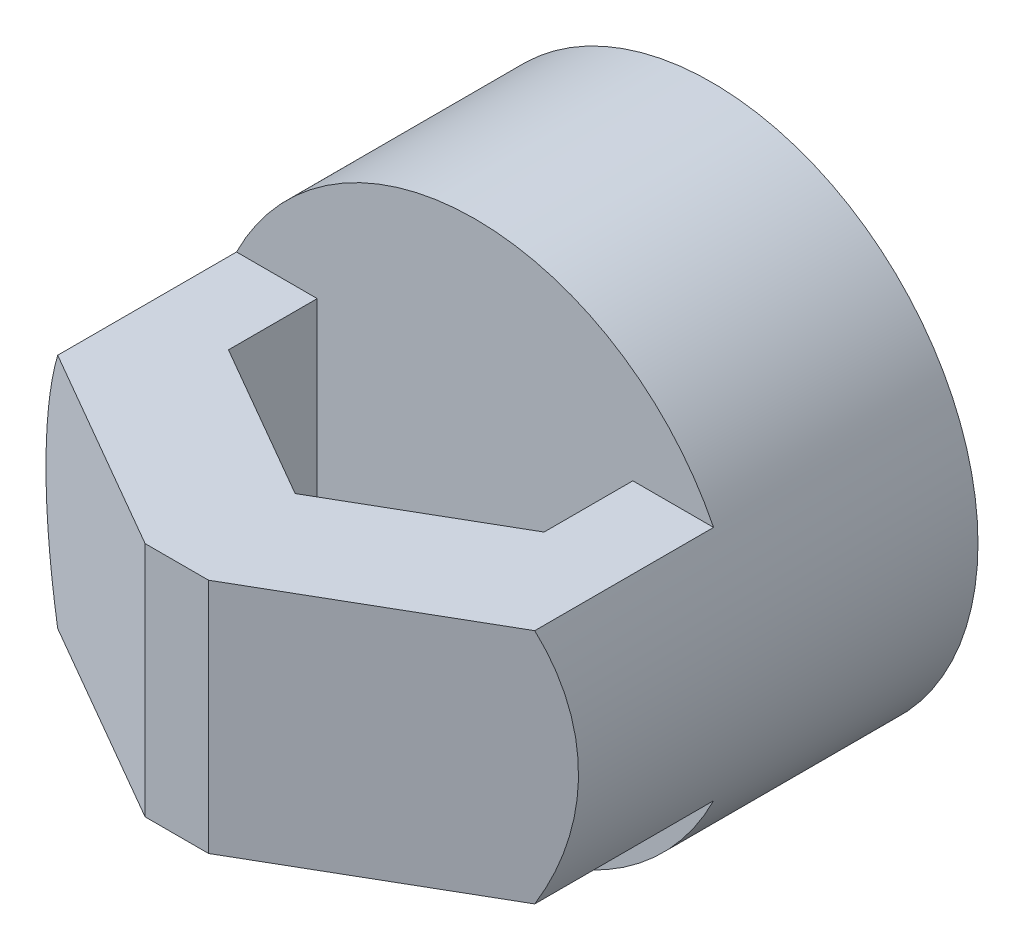
ISO-10303-21;
HEADER;
FILE_DESCRIPTION(('STEP AP214'),'2;1');
FILE_NAME('part.step','',(''),(''),'','','');
FILE_SCHEMA(('AUTOMOTIVE_DESIGN { 1 0 10303 214 1 1 1 1 }'));
ENDSEC;
DATA;
#1=APPLICATION_CONTEXT('core data for automotive mechanical design processes');
#2=APPLICATION_PROTOCOL_DEFINITION('international standard','automotive_design',2000,#1);
#3=PRODUCT_CONTEXT('',#1,'mechanical');
#4=PRODUCT('Part','Part','',(#3));
#5=PRODUCT_RELATED_PRODUCT_CATEGORY('part','',(#4));
#6=PRODUCT_DEFINITION_FORMATION('','',#4);
#7=PRODUCT_DEFINITION_CONTEXT('part definition',#1,'design');
#8=PRODUCT_DEFINITION('design','',#6,#7);
#9=PRODUCT_DEFINITION_SHAPE('','',#8);
#10=(LENGTH_UNIT() NAMED_UNIT(*) SI_UNIT(.MILLI.,.METRE.));
#11=(NAMED_UNIT(*) PLANE_ANGLE_UNIT() SI_UNIT($,.RADIAN.));
#12=(NAMED_UNIT(*) SI_UNIT($,.STERADIAN.) SOLID_ANGLE_UNIT());
#13=UNCERTAINTY_MEASURE_WITH_UNIT(LENGTH_MEASURE(1.E-05),#10,'distance_accuracy_value','');
#14=(GEOMETRIC_REPRESENTATION_CONTEXT(3) GLOBAL_UNCERTAINTY_ASSIGNED_CONTEXT((#13)) GLOBAL_UNIT_ASSIGNED_CONTEXT((#10,
#11,#12)) REPRESENTATION_CONTEXT('',''));
#15=CARTESIAN_POINT('',(0.,0.,0.));
#16=DIRECTION('',(0.,0.,1.));
#17=DIRECTION('',(1.,0.,0.));
#18=AXIS2_PLACEMENT_3D('',#15,#16,#17);
#19=CARTESIAN_POINT('',(-8.09657259915066,4.,14.0236751088989));
#20=DIRECTION('',(-0.500000000000001,0.,0.866025403784438));
#21=DIRECTION('',(0.866025403784438,0.,0.500000000000001));
#22=AXIS2_PLACEMENT_3D('',#19,#20,#21);
#23=PLANE('',#22);
#24=DIRECTION('',(-0.866025403784438,0.,-0.500000000000001));
#25=VECTOR('',#24,1.);
#26=CARTESIAN_POINT('',(-8.09657259915066,4.,14.0236751088989));
#27=LINE('',#26,#25);
#28=CARTESIAN_POINT('',(-1.07179676972449,4.,18.0794313250149));
#29=VERTEX_POINT('',#28);
#30=CARTESIAN_POINT('',(-8.06225774829855,4.,14.0434867972756));
#31=VERTEX_POINT('',#30);
#32=EDGE_CURVE('E222',#29,#31,#27,.T.);
#33=ORIENTED_EDGE('',*,*,#32,.T.);
#34=CARTESIAN_POINT('',(0.,0.,18.6982334785319));
#35=DIRECTION('',(-0.500000000000001,0.,0.866025403784438));
#36=DIRECTION('',(-0.866025403784438,0.,-0.500000000000001));
#37=AXIS2_PLACEMENT_3D('',#34,#35,#36);
#38=ELLIPSE('',#37,10.3923048454133,9.);
#39=CARTESIAN_POINT('',(-8.06225774829855,-4.,14.0434867972756));
#40=VERTEX_POINT('',#39);
#41=EDGE_CURVE('E234',#40,#31,#38,.F.);
#42=ORIENTED_EDGE('',*,*,#41,.F.);
#43=DIRECTION('',(-0.866025403784438,0.,-0.500000000000001));
#44=VECTOR('',#43,1.);
#45=CARTESIAN_POINT('',(-8.09657259915066,-4.,14.0236751088989));
#46=LINE('',#45,#44);
#47=CARTESIAN_POINT('',(-1.07179676972449,-4.,18.0794313250149));
#48=VERTEX_POINT('',#47);
#49=EDGE_CURVE('E172',#48,#40,#46,.T.);
#50=ORIENTED_EDGE('',*,*,#49,.F.);
#51=DIRECTION('',(0.,-1.,0.));
#52=VECTOR('',#51,1.);
#53=CARTESIAN_POINT('',(-1.07179676972449,4.,18.0794313250149));
#54=LINE('',#53,#52);
#55=EDGE_CURVE('E199',#29,#48,#54,.T.);
#56=ORIENTED_EDGE('',*,*,#55,.F.);
#57=EDGE_LOOP('',(#33,#42,#50,#56));
#58=FACE_BOUND('',#57,.T.);
#59=ADVANCED_FACE('F39',(#58),#23,.T.);
#60=CARTESIAN_POINT('',(8.09657259915066,4.,14.0236751088989));
#61=DIRECTION('',(0.500000000000001,0.,0.866025403784438));
#62=DIRECTION('',(0.866025403784438,0.,-0.500000000000001));
#63=AXIS2_PLACEMENT_3D('',#60,#61,#62);
#64=PLANE('',#63);
#65=DIRECTION('',(-0.866025403784438,0.,0.500000000000001));
#66=VECTOR('',#65,1.);
#67=CARTESIAN_POINT('',(8.09657259915066,-4.,14.0236751088989));
#68=LINE('',#67,#66);
#69=CARTESIAN_POINT('',(8.06225774829855,-4.,14.0434867972756));
#70=VERTEX_POINT('',#69);
#71=CARTESIAN_POINT('',(1.07179676972449,-4.,18.0794313250149));
#72=VERTEX_POINT('',#71);
#73=EDGE_CURVE('E142',#70,#72,#68,.T.);
#74=ORIENTED_EDGE('',*,*,#73,.F.);
#75=CARTESIAN_POINT('',(0.,0.,18.6982334785319));
#76=DIRECTION('',(0.500000000000001,0.,0.866025403784438));
#77=DIRECTION('',(0.866025403784438,0.,-0.500000000000001));
#78=AXIS2_PLACEMENT_3D('',#75,#76,#77);
#79=ELLIPSE('',#78,10.3923048454133,9.);
#80=CARTESIAN_POINT('',(8.06225774829855,4.,14.0434867972756));
#81=VERTEX_POINT('',#80);
#82=EDGE_CURVE('E54',#81,#70,#79,.F.);
#83=ORIENTED_EDGE('',*,*,#82,.F.);
#84=DIRECTION('',(-0.866025403784438,0.,0.500000000000001));
#85=VECTOR('',#84,1.);
#86=CARTESIAN_POINT('',(8.09657259915066,4.,14.0236751088989));
#87=LINE('',#86,#85);
#88=CARTESIAN_POINT('',(1.07179676972449,4.,18.0794313250149));
#89=VERTEX_POINT('',#88);
#90=EDGE_CURVE('E129',#81,#89,#87,.T.);
#91=ORIENTED_EDGE('',*,*,#90,.T.);
#92=DIRECTION('',(0.,-1.,0.));
#93=VECTOR('',#92,1.);
#94=CARTESIAN_POINT('',(1.07179676972449,4.,18.0794313250149));
#95=LINE('',#94,#93);
#96=EDGE_CURVE('E196',#89,#72,#95,.T.);
#97=ORIENTED_EDGE('',*,*,#96,.T.);
#98=EDGE_LOOP('',(#74,#83,#91,#97));
#99=FACE_BOUND('',#98,.T.);
#100=ADVANCED_FACE('F229',(#99),#64,.T.);
#101=CARTESIAN_POINT('',(0.,0.,0.));
#102=DIRECTION('',(0.,0.,1.));
#103=DIRECTION('',(1.,0.,0.));
#104=AXIS2_PLACEMENT_3D('',#101,#102,#103);
#105=PLANE('',#104);
#106=CARTESIAN_POINT('',(0.,0.,0.));
#107=DIRECTION('',(0.,0.,1.));
#108=DIRECTION('',(1.,0.,0.));
#109=AXIS2_PLACEMENT_3D('',#106,#107,#108);
#110=CIRCLE('',#109,9.);
#111=CARTESIAN_POINT('',(9.,0.,0.));
#112=VERTEX_POINT('',#111);
#113=EDGE_CURVE('E159',#112,#112,#110,.T.);
#114=ORIENTED_EDGE('',*,*,#113,.F.);
#115=EDGE_LOOP('',(#114));
#116=FACE_BOUND('',#115,.T.);
#117=CARTESIAN_POINT('',(0.,0.,0.));
#118=DIRECTION('',(0.,0.,1.));
#119=DIRECTION('',(1.,0.,0.));
#120=AXIS2_PLACEMENT_3D('',#117,#118,#119);
#121=CIRCLE('',#120,5.5);
#122=CARTESIAN_POINT('',(5.5,0.,0.));
#123=VERTEX_POINT('',#122);
#124=EDGE_CURVE('E151',#123,#123,#121,.T.);
#125=ORIENTED_EDGE('',*,*,#124,.T.);
#126=EDGE_LOOP('',(#125));
#127=FACE_BOUND('',#126,.T.);
#128=ADVANCED_FACE('F242',(#116,#127),#105,.F.);
#129=CARTESIAN_POINT('',(0.,0.,5.));
#130=DIRECTION('',(0.,0.,-1.));
#131=DIRECTION('',(-1.,0.,0.));
#132=AXIS2_PLACEMENT_3D('',#129,#130,#131);
#133=CYLINDRICAL_SURFACE('',#132,9.);
#134=CARTESIAN_POINT('',(0.,0.,8.));
#135=DIRECTION('',(0.,0.,1.));
#136=DIRECTION('',(1.,0.,0.));
#137=AXIS2_PLACEMENT_3D('',#134,#135,#136);
#138=CIRCLE('',#137,9.);
#139=CARTESIAN_POINT('',(8.06225774829855,4.,8.));
#140=VERTEX_POINT('',#139);
#141=CARTESIAN_POINT('',(-8.06225774829855,4.,8.));
#142=VERTEX_POINT('',#141);
#143=EDGE_CURVE('E138',#140,#142,#138,.T.);
#144=ORIENTED_EDGE('',*,*,#143,.F.);
#145=DIRECTION('',(0.,0.,-1.));
#146=VECTOR('',#145,1.);
#147=CARTESIAN_POINT('',(8.06225774829855,4.,18.0794313250149));
#148=LINE('',#147,#146);
#149=EDGE_CURVE('E122',#140,#81,#148,.F.);
#150=ORIENTED_EDGE('',*,*,#149,.T.);
#151=ORIENTED_EDGE('',*,*,#82,.T.);
#152=DIRECTION('',(0.,0.,-1.));
#153=VECTOR('',#152,1.);
#154=CARTESIAN_POINT('',(8.06225774829855,-4.,18.0794313250149));
#155=LINE('',#154,#153);
#156=CARTESIAN_POINT('',(8.06225774829855,-4.,8.));
#157=VERTEX_POINT('',#156);
#158=EDGE_CURVE('E12',#157,#70,#155,.F.);
#159=ORIENTED_EDGE('',*,*,#158,.F.);
#160=CARTESIAN_POINT('',(-8.06225774829855,-4.,8.));
#161=VERTEX_POINT('',#160);
#162=EDGE_CURVE('E148',#161,#157,#138,.T.);
#163=ORIENTED_EDGE('',*,*,#162,.F.);
#164=DIRECTION('',(0.,0.,-1.));
#165=VECTOR('',#164,1.);
#166=CARTESIAN_POINT('',(-8.06225774829855,-4.,18.0794313250149));
#167=LINE('',#166,#165);
#168=EDGE_CURVE('E47',#40,#161,#167,.T.);
#169=ORIENTED_EDGE('',*,*,#168,.F.);
#170=ORIENTED_EDGE('',*,*,#41,.T.);
#171=DIRECTION('',(0.,0.,-1.));
#172=VECTOR('',#171,1.);
#173=CARTESIAN_POINT('',(-8.06225774829855,4.,18.0794313250149));
#174=LINE('',#173,#172);
#175=EDGE_CURVE('E131',#31,#142,#174,.T.);
#176=ORIENTED_EDGE('',*,*,#175,.T.);
#177=EDGE_LOOP('',(#144,#150,#151,#159,#163,#169,#170,#176));
#178=FACE_BOUND('',#177,.T.);
#179=ORIENTED_EDGE('',*,*,#113,.T.);
#180=EDGE_LOOP('',(#179));
#181=FACE_BOUND('',#180,.T.);
#182=ADVANCED_FACE('F41',(#178,#181),#133,.T.);
#183=CARTESIAN_POINT('',(0.,0.,5.));
#184=DIRECTION('',(0.,0.,-1.));
#185=DIRECTION('',(-1.,0.,0.));
#186=AXIS2_PLACEMENT_3D('',#183,#184,#185);
#187=CYLINDRICAL_SURFACE('',#186,5.5);
#188=CARTESIAN_POINT('',(0.,0.,5.));
#189=DIRECTION('',(0.,0.,1.));
#190=DIRECTION('',(1.,0.,0.));
#191=AXIS2_PLACEMENT_3D('',#188,#189,#190);
#192=CIRCLE('',#191,5.5);
#193=CARTESIAN_POINT('',(5.5,0.,5.));
#194=VERTEX_POINT('',#193);
#195=EDGE_CURVE('E147',#194,#194,#192,.T.);
#196=ORIENTED_EDGE('',*,*,#195,.T.);
#197=EDGE_LOOP('',(#196));
#198=FACE_BOUND('',#197,.T.);
#199=ORIENTED_EDGE('',*,*,#124,.F.);
#200=EDGE_LOOP('',(#199));
#201=FACE_BOUND('',#200,.T.);
#202=ADVANCED_FACE('F264',(#198,#201),#187,.F.);
#203=CARTESIAN_POINT('',(0.,0.,5.));
#204=DIRECTION('',(0.,0.,1.));
#205=DIRECTION('',(1.,0.,0.));
#206=AXIS2_PLACEMENT_3D('',#203,#204,#205);
#207=PLANE('',#206);
#208=ORIENTED_EDGE('',*,*,#195,.F.);
#209=EDGE_LOOP('',(#208));
#210=FACE_BOUND('',#209,.T.);
#211=ADVANCED_FACE('F261',(#210),#207,.F.);
#212=CARTESIAN_POINT('',(0.,0.,8.));
#213=DIRECTION('',(0.,0.,1.));
#214=DIRECTION('',(1.,0.,0.));
#215=AXIS2_PLACEMENT_3D('',#212,#213,#214);
#216=PLANE('',#215);
#217=DIRECTION('',(1.,0.,0.));
#218=VECTOR('',#217,1.);
#219=CARTESIAN_POINT('',(0.,4.,8.));
#220=LINE('',#219,#218);
#221=CARTESIAN_POINT('',(5.33373151334493,4.,8.));
#222=VERTEX_POINT('',#221);
#223=EDGE_CURVE('E126',#222,#140,#220,.T.);
#224=ORIENTED_EDGE('',*,*,#223,.T.);
#225=ORIENTED_EDGE('',*,*,#143,.T.);
#226=DIRECTION('',(-1.,0.,0.));
#227=VECTOR('',#226,1.);
#228=CARTESIAN_POINT('',(0.,4.,8.));
#229=LINE('',#228,#227);
#230=CARTESIAN_POINT('',(-5.33373151334493,4.,8.));
#231=VERTEX_POINT('',#230);
#232=EDGE_CURVE('E165',#231,#142,#229,.T.);
#233=ORIENTED_EDGE('',*,*,#232,.F.);
#234=DIRECTION('',(0.,-1.,0.));
#235=VECTOR('',#234,1.);
#236=CARTESIAN_POINT('',(-5.33373151334493,4.,8.));
#237=LINE('',#236,#235);
#238=CARTESIAN_POINT('',(-5.33373151334493,-4.,8.));
#239=VERTEX_POINT('',#238);
#240=EDGE_CURVE('E176',#231,#239,#237,.T.);
#241=ORIENTED_EDGE('',*,*,#240,.T.);
#242=DIRECTION('',(-1.,0.,0.));
#243=VECTOR('',#242,1.);
#244=CARTESIAN_POINT('',(0.,-4.,8.));
#245=LINE('',#244,#243);
#246=EDGE_CURVE('E162',#239,#161,#245,.T.);
#247=ORIENTED_EDGE('',*,*,#246,.T.);
#248=ORIENTED_EDGE('',*,*,#162,.T.);
#249=DIRECTION('',(1.,0.,0.));
#250=VECTOR('',#249,1.);
#251=CARTESIAN_POINT('',(0.,-4.,8.));
#252=LINE('',#251,#250);
#253=CARTESIAN_POINT('',(5.33373151334493,-4.,8.));
#254=VERTEX_POINT('',#253);
#255=EDGE_CURVE('E178',#254,#157,#252,.T.);
#256=ORIENTED_EDGE('',*,*,#255,.F.);
#257=DIRECTION('',(0.,-1.,0.));
#258=VECTOR('',#257,1.);
#259=CARTESIAN_POINT('',(5.33373151334493,4.,8.));
#260=LINE('',#259,#258);
#261=EDGE_CURVE('E140',#222,#254,#260,.T.);
#262=ORIENTED_EDGE('',*,*,#261,.F.);
#263=EDGE_LOOP('',(#224,#225,#233,#241,#247,#248,#256,#262));
#264=FACE_BOUND('',#263,.T.);
#265=ADVANCED_FACE('F136',(#264),#216,.T.);
#266=CARTESIAN_POINT('',(5.33373151334493,4.,0.));
#267=DIRECTION('',(-1.,0.,0.));
#268=DIRECTION('',(0.,0.,1.));
#269=AXIS2_PLACEMENT_3D('',#266,#267,#268);
#270=PLANE('',#269);
#271=DIRECTION('',(0.,0.,-1.));
#272=VECTOR('',#271,1.);
#273=CARTESIAN_POINT('',(5.33373151334493,-4.,0.));
#274=LINE('',#273,#272);
#275=CARTESIAN_POINT('',(5.33373151334493,-4.,11.));
#276=VERTEX_POINT('',#275);
#277=EDGE_CURVE('E61',#276,#254,#274,.T.);
#278=ORIENTED_EDGE('',*,*,#277,.F.);
#279=DIRECTION('',(0.,-1.,0.));
#280=VECTOR('',#279,1.);
#281=CARTESIAN_POINT('',(5.33373151334493,4.,11.));
#282=LINE('',#281,#280);
#283=CARTESIAN_POINT('',(5.33373151334493,4.,11.));
#284=VERTEX_POINT('',#283);
#285=EDGE_CURVE('E205',#284,#276,#282,.T.);
#286=ORIENTED_EDGE('',*,*,#285,.F.);
#287=DIRECTION('',(0.,0.,-1.));
#288=VECTOR('',#287,1.);
#289=CARTESIAN_POINT('',(5.33373151334493,4.,0.));
#290=LINE('',#289,#288);
#291=EDGE_CURVE('E141',#284,#222,#290,.T.);
#292=ORIENTED_EDGE('',*,*,#291,.T.);
#293=ORIENTED_EDGE('',*,*,#261,.T.);
#294=EDGE_LOOP('',(#278,#286,#292,#293));
#295=FACE_BOUND('',#294,.T.);
#296=ADVANCED_FACE('F210',(#295),#270,.T.);
#297=CARTESIAN_POINT('',(6.09657259915066,4.,10.5595734937612));
#298=DIRECTION('',(-0.500000000000002,0.,-0.866025403784438));
#299=DIRECTION('',(-0.866025403784438,0.,0.500000000000001));
#300=AXIS2_PLACEMENT_3D('',#297,#298,#299);
#301=PLANE('',#300);
#302=DIRECTION('',(0.866025403784438,0.,-0.500000000000002));
#303=VECTOR('',#302,1.);
#304=CARTESIAN_POINT('',(6.09657259915066,-4.,10.5595734937612));
#305=LINE('',#304,#303);
#306=CARTESIAN_POINT('',(0.,-4.,14.0794313250149));
#307=VERTEX_POINT('',#306);
#308=EDGE_CURVE('E180',#307,#276,#305,.T.);
#309=ORIENTED_EDGE('',*,*,#308,.F.);
#310=DIRECTION('',(0.,-1.,0.));
#311=VECTOR('',#310,1.);
#312=CARTESIAN_POINT('',(0.,4.,14.0794313250149));
#313=LINE('',#312,#311);
#314=CARTESIAN_POINT('',(0.,4.,14.0794313250149));
#315=VERTEX_POINT('',#314);
#316=EDGE_CURVE('E204',#315,#307,#313,.T.);
#317=ORIENTED_EDGE('',*,*,#316,.F.);
#318=DIRECTION('',(0.866025403784438,0.,-0.500000000000002));
#319=VECTOR('',#318,1.);
#320=CARTESIAN_POINT('',(6.09657259915066,4.,10.5595734937612));
#321=LINE('',#320,#319);
#322=EDGE_CURVE('E212',#315,#284,#321,.T.);
#323=ORIENTED_EDGE('',*,*,#322,.T.);
#324=ORIENTED_EDGE('',*,*,#285,.T.);
#325=EDGE_LOOP('',(#309,#317,#323,#324));
#326=FACE_BOUND('',#325,.T.);
#327=ADVANCED_FACE('F253',(#326),#301,.T.);
#328=CARTESIAN_POINT('',(-6.09657259915066,4.,10.5595734937612));
#329=DIRECTION('',(0.500000000000001,0.,-0.866025403784438));
#330=DIRECTION('',(-0.866025403784438,0.,-0.500000000000001));
#331=AXIS2_PLACEMENT_3D('',#328,#329,#330);
#332=PLANE('',#331);
#333=DIRECTION('',(0.866025403784438,0.,0.500000000000001));
#334=VECTOR('',#333,1.);
#335=CARTESIAN_POINT('',(-6.09657259915066,-4.,10.5595734937612));
#336=LINE('',#335,#334);
#337=CARTESIAN_POINT('',(-5.33373151334493,-4.,11.));
#338=VERTEX_POINT('',#337);
#339=EDGE_CURVE('E187',#338,#307,#336,.T.);
#340=ORIENTED_EDGE('',*,*,#339,.F.);
#341=DIRECTION('',(0.,-1.,0.));
#342=VECTOR('',#341,1.);
#343=CARTESIAN_POINT('',(-5.33373151334493,4.,11.));
#344=LINE('',#343,#342);
#345=CARTESIAN_POINT('',(-5.33373151334493,4.,11.));
#346=VERTEX_POINT('',#345);
#347=EDGE_CURVE('E202',#346,#338,#344,.T.);
#348=ORIENTED_EDGE('',*,*,#347,.F.);
#349=DIRECTION('',(0.866025403784438,0.,0.500000000000001));
#350=VECTOR('',#349,1.);
#351=CARTESIAN_POINT('',(-6.09657259915066,4.,10.5595734937612));
#352=LINE('',#351,#350);
#353=EDGE_CURVE('E214',#346,#315,#352,.T.);
#354=ORIENTED_EDGE('',*,*,#353,.T.);
#355=ORIENTED_EDGE('',*,*,#316,.T.);
#356=EDGE_LOOP('',(#340,#348,#354,#355));
#357=FACE_BOUND('',#356,.T.);
#358=ADVANCED_FACE('F249',(#357),#332,.T.);
#359=CARTESIAN_POINT('',(-5.33373151334493,4.,0.));
#360=DIRECTION('',(1.,0.,0.));
#361=DIRECTION('',(0.,0.,-1.));
#362=AXIS2_PLACEMENT_3D('',#359,#360,#361);
#363=PLANE('',#362);
#364=DIRECTION('',(0.,0.,1.));
#365=VECTOR('',#364,1.);
#366=CARTESIAN_POINT('',(-5.33373151334493,-4.,0.));
#367=LINE('',#366,#365);
#368=EDGE_CURVE('E190',#239,#338,#367,.T.);
#369=ORIENTED_EDGE('',*,*,#368,.F.);
#370=ORIENTED_EDGE('',*,*,#240,.F.);
#371=DIRECTION('',(0.,0.,1.));
#372=VECTOR('',#371,1.);
#373=CARTESIAN_POINT('',(-5.33373151334493,4.,0.));
#374=LINE('',#373,#372);
#375=EDGE_CURVE('E219',#231,#346,#374,.T.);
#376=ORIENTED_EDGE('',*,*,#375,.T.);
#377=ORIENTED_EDGE('',*,*,#347,.T.);
#378=EDGE_LOOP('',(#369,#370,#376,#377));
#379=FACE_BOUND('',#378,.T.);
#380=ADVANCED_FACE('F246',(#379),#363,.T.);
#381=CARTESIAN_POINT('',(0.,4.,18.0794313250149));
#382=DIRECTION('',(0.,0.,1.));
#383=DIRECTION('',(1.,0.,0.));
#384=AXIS2_PLACEMENT_3D('',#381,#382,#383);
#385=PLANE('',#384);
#386=DIRECTION('',(-1.,0.,0.));
#387=VECTOR('',#386,1.);
#388=CARTESIAN_POINT('',(0.,-4.,18.0794313250149));
#389=LINE('',#388,#387);
#390=EDGE_CURVE('E193',#72,#48,#389,.T.);
#391=ORIENTED_EDGE('',*,*,#390,.F.);
#392=ORIENTED_EDGE('',*,*,#96,.F.);
#393=DIRECTION('',(-1.,0.,0.));
#394=VECTOR('',#393,1.);
#395=CARTESIAN_POINT('',(0.,4.,18.0794313250149));
#396=LINE('',#395,#394);
#397=EDGE_CURVE('E224',#89,#29,#396,.T.);
#398=ORIENTED_EDGE('',*,*,#397,.T.);
#399=ORIENTED_EDGE('',*,*,#55,.T.);
#400=EDGE_LOOP('',(#391,#392,#398,#399));
#401=FACE_BOUND('',#400,.T.);
#402=ADVANCED_FACE('F231',(#401),#385,.T.);
#403=CARTESIAN_POINT('',(0.,4.,0.));
#404=DIRECTION('',(0.,1.,0.));
#405=DIRECTION('',(0.,0.,1.));
#406=AXIS2_PLACEMENT_3D('',#403,#404,#405);
#407=PLANE('',#406);
#408=ORIENTED_EDGE('',*,*,#149,.F.);
#409=ORIENTED_EDGE('',*,*,#223,.F.);
#410=ORIENTED_EDGE('',*,*,#291,.F.);
#411=ORIENTED_EDGE('',*,*,#322,.F.);
#412=ORIENTED_EDGE('',*,*,#353,.F.);
#413=ORIENTED_EDGE('',*,*,#375,.F.);
#414=ORIENTED_EDGE('',*,*,#232,.T.);
#415=ORIENTED_EDGE('',*,*,#175,.F.);
#416=ORIENTED_EDGE('',*,*,#32,.F.);
#417=ORIENTED_EDGE('',*,*,#397,.F.);
#418=ORIENTED_EDGE('',*,*,#90,.F.);
#419=EDGE_LOOP('',(#408,#409,#410,#411,#412,#413,#414,#415,#416,#417,#418));
#420=FACE_BOUND('',#419,.T.);
#421=ADVANCED_FACE('F124',(#420),#407,.T.);
#422=CARTESIAN_POINT('',(0.,-4.,0.));
#423=DIRECTION('',(0.,1.,0.));
#424=DIRECTION('',(0.,0.,1.));
#425=AXIS2_PLACEMENT_3D('',#422,#423,#424);
#426=PLANE('',#425);
#427=ORIENTED_EDGE('',*,*,#255,.T.);
#428=ORIENTED_EDGE('',*,*,#158,.T.);
#429=ORIENTED_EDGE('',*,*,#73,.T.);
#430=ORIENTED_EDGE('',*,*,#390,.T.);
#431=ORIENTED_EDGE('',*,*,#49,.T.);
#432=ORIENTED_EDGE('',*,*,#168,.T.);
#433=ORIENTED_EDGE('',*,*,#246,.F.);
#434=ORIENTED_EDGE('',*,*,#368,.T.);
#435=ORIENTED_EDGE('',*,*,#339,.T.);
#436=ORIENTED_EDGE('',*,*,#308,.T.);
#437=ORIENTED_EDGE('',*,*,#277,.T.);
#438=EDGE_LOOP('',(#427,#428,#429,#430,#431,#432,#433,#434,#435,#436,#437));
#439=FACE_BOUND('',#438,.T.);
#440=ADVANCED_FACE('F167',(#439),#426,.F.);
#441=CLOSED_SHELL('',(#59,#100,#128,#182,#202,#211,#265,#296,#327,#358,#380,#402,#421,#440));
#442=MANIFOLD_SOLID_BREP('B2',#441);
#443=ADVANCED_BREP_SHAPE_REPRESENTATION('',(#18,#442),#14);
#444=SHAPE_DEFINITION_REPRESENTATION(#9,#443);
ENDSEC;
END-ISO-10303-21;
